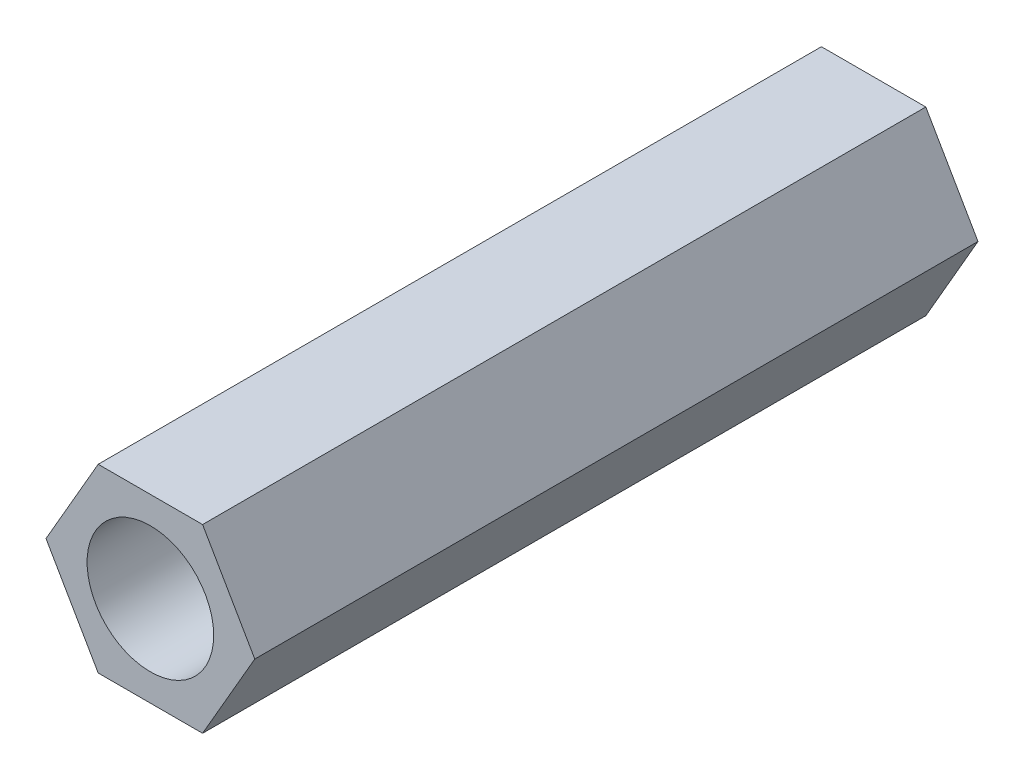
ISO-10303-21;
HEADER;
FILE_DESCRIPTION(('STEP AP214'),'2;1');
FILE_NAME('part.step','',(''),(''),'','','');
FILE_SCHEMA(('AUTOMOTIVE_DESIGN { 1 0 10303 214 1 1 1 1 }'));
ENDSEC;
DATA;
#1=APPLICATION_CONTEXT('core data for automotive mechanical design processes');
#2=APPLICATION_PROTOCOL_DEFINITION('international standard','automotive_design',2000,#1);
#3=PRODUCT_CONTEXT('',#1,'mechanical');
#4=PRODUCT('Part','Part','',(#3));
#5=PRODUCT_RELATED_PRODUCT_CATEGORY('part','',(#4));
#6=PRODUCT_DEFINITION_FORMATION('','',#4);
#7=PRODUCT_DEFINITION_CONTEXT('part definition',#1,'design');
#8=PRODUCT_DEFINITION('design','',#6,#7);
#9=PRODUCT_DEFINITION_SHAPE('','',#8);
#10=(LENGTH_UNIT() NAMED_UNIT(*) SI_UNIT(.MILLI.,.METRE.));
#11=(NAMED_UNIT(*) PLANE_ANGLE_UNIT() SI_UNIT($,.RADIAN.));
#12=(NAMED_UNIT(*) SI_UNIT($,.STERADIAN.) SOLID_ANGLE_UNIT());
#13=UNCERTAINTY_MEASURE_WITH_UNIT(LENGTH_MEASURE(1.E-05),#10,'distance_accuracy_value','');
#14=(GEOMETRIC_REPRESENTATION_CONTEXT(3) GLOBAL_UNCERTAINTY_ASSIGNED_CONTEXT((#13)) GLOBAL_UNIT_ASSIGNED_CONTEXT((#10,
#11,#12)) REPRESENTATION_CONTEXT('',''));
#15=CARTESIAN_POINT('',(0.,0.,0.));
#16=DIRECTION('',(0.,0.,1.));
#17=DIRECTION('',(1.,0.,0.));
#18=AXIS2_PLACEMENT_3D('',#15,#16,#17);
#19=CARTESIAN_POINT('',(0.,0.,0.));
#20=DIRECTION('',(0.,0.,1.));
#21=DIRECTION('',(1.,0.,0.));
#22=AXIS2_PLACEMENT_3D('',#19,#20,#21);
#23=PLANE('',#22);
#24=DIRECTION('',(0.5,0.866025403784439,0.));
#25=VECTOR('',#24,1.);
#26=CARTESIAN_POINT('',(2.88675134594813,-5.,0.));
#27=LINE('',#26,#25);
#28=CARTESIAN_POINT('',(2.88675134594813,-5.,0.));
#29=VERTEX_POINT('',#28);
#30=CARTESIAN_POINT('',(5.77350269189626,0.,0.));
#31=VERTEX_POINT('',#30);
#32=EDGE_CURVE('E119',#29,#31,#27,.T.);
#33=ORIENTED_EDGE('',*,*,#32,.F.);
#34=DIRECTION('',(1.,0.,0.));
#35=VECTOR('',#34,1.);
#36=CARTESIAN_POINT('',(-2.88675134594813,-5.,0.));
#37=LINE('',#36,#35);
#38=CARTESIAN_POINT('',(-2.88675134594813,-5.,0.));
#39=VERTEX_POINT('',#38);
#40=EDGE_CURVE('E79',#39,#29,#37,.T.);
#41=ORIENTED_EDGE('',*,*,#40,.F.);
#42=DIRECTION('',(0.5,-0.866025403784439,0.));
#43=VECTOR('',#42,1.);
#44=CARTESIAN_POINT('',(-5.77350269189626,0.,0.));
#45=LINE('',#44,#43);
#46=CARTESIAN_POINT('',(-5.77350269189626,0.,0.));
#47=VERTEX_POINT('',#46);
#48=EDGE_CURVE('E73',#47,#39,#45,.T.);
#49=ORIENTED_EDGE('',*,*,#48,.F.);
#50=DIRECTION('',(-0.5,-0.866025403784439,0.));
#51=VECTOR('',#50,1.);
#52=CARTESIAN_POINT('',(-2.88675134594813,5.,0.));
#53=LINE('',#52,#51);
#54=CARTESIAN_POINT('',(-2.88675134594813,5.,0.));
#55=VERTEX_POINT('',#54);
#56=EDGE_CURVE('E109',#55,#47,#53,.T.);
#57=ORIENTED_EDGE('',*,*,#56,.F.);
#58=DIRECTION('',(-1.,0.,0.));
#59=VECTOR('',#58,1.);
#60=CARTESIAN_POINT('',(2.88675134594813,5.,0.));
#61=LINE('',#60,#59);
#62=CARTESIAN_POINT('',(2.88675134594813,5.,0.));
#63=VERTEX_POINT('',#62);
#64=EDGE_CURVE('E125',#63,#55,#61,.T.);
#65=ORIENTED_EDGE('',*,*,#64,.F.);
#66=DIRECTION('',(-0.5,0.866025403784439,0.));
#67=VECTOR('',#66,1.);
#68=CARTESIAN_POINT('',(5.77350269189626,0.,0.));
#69=LINE('',#68,#67);
#70=EDGE_CURVE('E122',#31,#63,#69,.T.);
#71=ORIENTED_EDGE('',*,*,#70,.F.);
#72=EDGE_LOOP('',(#33,#41,#49,#57,#65,#71));
#73=FACE_BOUND('',#72,.T.);
#74=CARTESIAN_POINT('',(0.,0.,0.));
#75=DIRECTION('',(0.,0.,-1.));
#76=DIRECTION('',(-1.,0.,0.));
#77=AXIS2_PLACEMENT_3D('',#74,#75,#76);
#78=CIRCLE('',#77,4.);
#79=CARTESIAN_POINT('',(-4.,0.,0.));
#80=VERTEX_POINT('',#79);
#81=EDGE_CURVE('E183',#80,#80,#78,.T.);
#82=ORIENTED_EDGE('',*,*,#81,.F.);
#83=EDGE_LOOP('',(#82));
#84=FACE_BOUND('',#83,.T.);
#85=ADVANCED_FACE('F32',(#73,#84),#23,.F.);
#86=CARTESIAN_POINT('',(2.88675134594813,-5.,40.));
#87=DIRECTION('',(-0.866025403784439,0.5,0.));
#88=DIRECTION('',(-0.5,-0.866025403784439,0.));
#89=AXIS2_PLACEMENT_3D('',#86,#87,#88);
#90=PLANE('',#89);
#91=ORIENTED_EDGE('',*,*,#32,.T.);
#92=DIRECTION('',(0.,0.,-1.));
#93=VECTOR('',#92,1.);
#94=CARTESIAN_POINT('',(5.77350269189626,0.,40.));
#95=LINE('',#94,#93);
#96=CARTESIAN_POINT('',(5.77350269189626,0.,40.));
#97=VERTEX_POINT('',#96);
#98=EDGE_CURVE('E11',#97,#31,#95,.T.);
#99=ORIENTED_EDGE('',*,*,#98,.F.);
#100=DIRECTION('',(0.5,0.866025403784439,0.));
#101=VECTOR('',#100,1.);
#102=CARTESIAN_POINT('',(2.88675134594813,-5.,40.));
#103=LINE('',#102,#101);
#104=CARTESIAN_POINT('',(2.88675134594813,-5.,40.));
#105=VERTEX_POINT('',#104);
#106=EDGE_CURVE('E130',#105,#97,#103,.T.);
#107=ORIENTED_EDGE('',*,*,#106,.F.);
#108=DIRECTION('',(0.,0.,-1.));
#109=VECTOR('',#108,1.);
#110=CARTESIAN_POINT('',(2.88675134594813,-5.,40.));
#111=LINE('',#110,#109);
#112=EDGE_CURVE('E115',#105,#29,#111,.T.);
#113=ORIENTED_EDGE('',*,*,#112,.T.);
#114=EDGE_LOOP('',(#91,#99,#107,#113));
#115=FACE_BOUND('',#114,.T.);
#116=ADVANCED_FACE('F34',(#115),#90,.F.);
#117=CARTESIAN_POINT('',(5.77350269189626,0.,40.));
#118=DIRECTION('',(-0.866025403784439,-0.5,0.));
#119=DIRECTION('',(0.5,-0.866025403784439,0.));
#120=AXIS2_PLACEMENT_3D('',#117,#118,#119);
#121=PLANE('',#120);
#122=ORIENTED_EDGE('',*,*,#70,.T.);
#123=DIRECTION('',(0.,0.,-1.));
#124=VECTOR('',#123,1.);
#125=CARTESIAN_POINT('',(2.88675134594813,5.,40.));
#126=LINE('',#125,#124);
#127=CARTESIAN_POINT('',(2.88675134594813,5.,40.));
#128=VERTEX_POINT('',#127);
#129=EDGE_CURVE('E41',#128,#63,#126,.T.);
#130=ORIENTED_EDGE('',*,*,#129,.F.);
#131=DIRECTION('',(-0.5,0.866025403784439,0.));
#132=VECTOR('',#131,1.);
#133=CARTESIAN_POINT('',(5.77350269189626,0.,40.));
#134=LINE('',#133,#132);
#135=EDGE_CURVE('E87',#97,#128,#134,.T.);
#136=ORIENTED_EDGE('',*,*,#135,.F.);
#137=ORIENTED_EDGE('',*,*,#98,.T.);
#138=EDGE_LOOP('',(#122,#130,#136,#137));
#139=FACE_BOUND('',#138,.T.);
#140=ADVANCED_FACE('F159',(#139),#121,.F.);
#141=CARTESIAN_POINT('',(2.88675134594813,5.,40.));
#142=DIRECTION('',(0.,-1.,0.));
#143=DIRECTION('',(1.,0.,0.));
#144=AXIS2_PLACEMENT_3D('',#141,#142,#143);
#145=PLANE('',#144);
#146=ORIENTED_EDGE('',*,*,#64,.T.);
#147=DIRECTION('',(0.,0.,-1.));
#148=VECTOR('',#147,1.);
#149=CARTESIAN_POINT('',(-2.88675134594813,5.,40.));
#150=LINE('',#149,#148);
#151=CARTESIAN_POINT('',(-2.88675134594813,5.,40.));
#152=VERTEX_POINT('',#151);
#153=EDGE_CURVE('E110',#152,#55,#150,.T.);
#154=ORIENTED_EDGE('',*,*,#153,.F.);
#155=DIRECTION('',(-1.,0.,0.));
#156=VECTOR('',#155,1.);
#157=CARTESIAN_POINT('',(2.88675134594813,5.,40.));
#158=LINE('',#157,#156);
#159=EDGE_CURVE('E101',#128,#152,#158,.T.);
#160=ORIENTED_EDGE('',*,*,#159,.F.);
#161=ORIENTED_EDGE('',*,*,#129,.T.);
#162=EDGE_LOOP('',(#146,#154,#160,#161));
#163=FACE_BOUND('',#162,.T.);
#164=ADVANCED_FACE('F136',(#163),#145,.F.);
#165=CARTESIAN_POINT('',(-2.88675134594813,5.,40.));
#166=DIRECTION('',(0.866025403784439,-0.5,0.));
#167=DIRECTION('',(0.5,0.866025403784439,0.));
#168=AXIS2_PLACEMENT_3D('',#165,#166,#167);
#169=PLANE('',#168);
#170=ORIENTED_EDGE('',*,*,#56,.T.);
#171=DIRECTION('',(0.,0.,-1.));
#172=VECTOR('',#171,1.);
#173=CARTESIAN_POINT('',(-5.77350269189626,0.,40.));
#174=LINE('',#173,#172);
#175=CARTESIAN_POINT('',(-5.77350269189626,0.,40.));
#176=VERTEX_POINT('',#175);
#177=EDGE_CURVE('E106',#176,#47,#174,.T.);
#178=ORIENTED_EDGE('',*,*,#177,.F.);
#179=DIRECTION('',(-0.5,-0.866025403784439,0.));
#180=VECTOR('',#179,1.);
#181=CARTESIAN_POINT('',(-2.88675134594813,5.,40.));
#182=LINE('',#181,#180);
#183=EDGE_CURVE('E95',#152,#176,#182,.T.);
#184=ORIENTED_EDGE('',*,*,#183,.F.);
#185=ORIENTED_EDGE('',*,*,#153,.T.);
#186=EDGE_LOOP('',(#170,#178,#184,#185));
#187=FACE_BOUND('',#186,.T.);
#188=ADVANCED_FACE('F107',(#187),#169,.F.);
#189=CARTESIAN_POINT('',(-5.77350269189626,0.,40.));
#190=DIRECTION('',(0.866025403784439,0.5,0.));
#191=DIRECTION('',(-0.5,0.866025403784439,0.));
#192=AXIS2_PLACEMENT_3D('',#189,#190,#191);
#193=PLANE('',#192);
#194=ORIENTED_EDGE('',*,*,#48,.T.);
#195=DIRECTION('',(0.,0.,-1.));
#196=VECTOR('',#195,1.);
#197=CARTESIAN_POINT('',(-2.88675134594813,-5.,40.));
#198=LINE('',#197,#196);
#199=CARTESIAN_POINT('',(-2.88675134594813,-5.,40.));
#200=VERTEX_POINT('',#199);
#201=EDGE_CURVE('E111',#200,#39,#198,.T.);
#202=ORIENTED_EDGE('',*,*,#201,.F.);
#203=DIRECTION('',(0.5,-0.866025403784439,0.));
#204=VECTOR('',#203,1.);
#205=CARTESIAN_POINT('',(-5.77350269189626,0.,40.));
#206=LINE('',#205,#204);
#207=EDGE_CURVE('E99',#176,#200,#206,.T.);
#208=ORIENTED_EDGE('',*,*,#207,.F.);
#209=ORIENTED_EDGE('',*,*,#177,.T.);
#210=EDGE_LOOP('',(#194,#202,#208,#209));
#211=FACE_BOUND('',#210,.T.);
#212=ADVANCED_FACE('F113',(#211),#193,.F.);
#213=CARTESIAN_POINT('',(-2.88675134594813,-5.,40.));
#214=DIRECTION('',(0.,1.,0.));
#215=DIRECTION('',(-1.,0.,0.));
#216=AXIS2_PLACEMENT_3D('',#213,#214,#215);
#217=PLANE('',#216);
#218=ORIENTED_EDGE('',*,*,#40,.T.);
#219=ORIENTED_EDGE('',*,*,#112,.F.);
#220=DIRECTION('',(1.,0.,0.));
#221=VECTOR('',#220,1.);
#222=CARTESIAN_POINT('',(-2.88675134594813,-5.,40.));
#223=LINE('',#222,#221);
#224=EDGE_CURVE('E49',#200,#105,#223,.T.);
#225=ORIENTED_EDGE('',*,*,#224,.F.);
#226=ORIENTED_EDGE('',*,*,#201,.T.);
#227=EDGE_LOOP('',(#218,#219,#225,#226));
#228=FACE_BOUND('',#227,.T.);
#229=ADVANCED_FACE('F143',(#228),#217,.F.);
#230=CARTESIAN_POINT('',(0.,0.,40.));
#231=DIRECTION('',(0.,0.,1.));
#232=DIRECTION('',(1.,0.,0.));
#233=AXIS2_PLACEMENT_3D('',#230,#231,#232);
#234=PLANE('',#233);
#235=CARTESIAN_POINT('',(0.,0.,40.));
#236=DIRECTION('',(0.,0.,1.));
#237=DIRECTION('',(1.,0.,0.));
#238=AXIS2_PLACEMENT_3D('',#235,#236,#237);
#239=CIRCLE('',#238,3.5);
#240=CARTESIAN_POINT('',(3.5,0.,40.));
#241=VERTEX_POINT('',#240);
#242=EDGE_CURVE('E185',#241,#241,#239,.T.);
#243=ORIENTED_EDGE('',*,*,#242,.F.);
#244=EDGE_LOOP('',(#243));
#245=FACE_BOUND('',#244,.T.);
#246=ORIENTED_EDGE('',*,*,#106,.T.);
#247=ORIENTED_EDGE('',*,*,#135,.T.);
#248=ORIENTED_EDGE('',*,*,#159,.T.);
#249=ORIENTED_EDGE('',*,*,#183,.T.);
#250=ORIENTED_EDGE('',*,*,#207,.T.);
#251=ORIENTED_EDGE('',*,*,#224,.T.);
#252=EDGE_LOOP('',(#246,#247,#248,#249,#250,#251));
#253=FACE_BOUND('',#252,.T.);
#254=ADVANCED_FACE('F97',(#245,#253),#234,.T.);
#255=CARTESIAN_POINT('',(0.,0.,25.));
#256=DIRECTION('',(0.,0.,1.));
#257=DIRECTION('',(1.,0.,0.));
#258=AXIS2_PLACEMENT_3D('',#255,#256,#257);
#259=CYLINDRICAL_SURFACE('',#258,3.5);
#260=CARTESIAN_POINT('',(0.,0.,25.));
#261=DIRECTION('',(0.,0.,1.));
#262=DIRECTION('',(1.,0.,0.));
#263=AXIS2_PLACEMENT_3D('',#260,#261,#262);
#264=CIRCLE('',#263,3.5);
#265=CARTESIAN_POINT('',(3.5,0.,25.));
#266=VERTEX_POINT('',#265);
#267=EDGE_CURVE('E123',#266,#266,#264,.T.);
#268=ORIENTED_EDGE('',*,*,#267,.F.);
#269=EDGE_LOOP('',(#268));
#270=FACE_BOUND('',#269,.T.);
#271=ORIENTED_EDGE('',*,*,#242,.T.);
#272=EDGE_LOOP('',(#271));
#273=FACE_BOUND('',#272,.T.);
#274=ADVANCED_FACE('F150',(#270,#273),#259,.F.);
#275=CARTESIAN_POINT('',(0.,0.,25.));
#276=DIRECTION('',(0.,0.,1.));
#277=DIRECTION('',(1.,0.,0.));
#278=AXIS2_PLACEMENT_3D('',#275,#276,#277);
#279=PLANE('',#278);
#280=ORIENTED_EDGE('',*,*,#267,.T.);
#281=EDGE_LOOP('',(#280));
#282=FACE_BOUND('',#281,.T.);
#283=ADVANCED_FACE('F163',(#282),#279,.T.);
#284=CARTESIAN_POINT('',(0.,0.,15.));
#285=DIRECTION('',(0.,0.,-1.));
#286=DIRECTION('',(-1.,0.,0.));
#287=AXIS2_PLACEMENT_3D('',#284,#285,#286);
#288=CONICAL_SURFACE('',#287,4.,1.02974425867665);
#289=CARTESIAN_POINT('',(0.,0.,17.4034424761102));
#290=VERTEX_POINT('',#289);
#291=VERTEX_LOOP('',#290);
#292=FACE_BOUND('',#291,.T.);
#293=CARTESIAN_POINT('',(0.,0.,15.));
#294=DIRECTION('',(0.,0.,-1.));
#295=DIRECTION('',(-1.,0.,0.));
#296=AXIS2_PLACEMENT_3D('',#293,#294,#295);
#297=CIRCLE('',#296,4.);
#298=CARTESIAN_POINT('',(-4.,0.,15.));
#299=VERTEX_POINT('',#298);
#300=EDGE_CURVE('E180',#299,#299,#297,.T.);
#301=ORIENTED_EDGE('',*,*,#300,.T.);
#302=EDGE_LOOP('',(#301));
#303=FACE_BOUND('',#302,.T.);
#304=ADVANCED_FACE('F167',(#292,#303),#288,.F.);
#305=CARTESIAN_POINT('',(0.,0.,0.));
#306=DIRECTION('',(0.,0.,-1.));
#307=DIRECTION('',(-1.,0.,0.));
#308=AXIS2_PLACEMENT_3D('',#305,#306,#307);
#309=CYLINDRICAL_SURFACE('',#308,4.);
#310=ORIENTED_EDGE('',*,*,#300,.F.);
#311=EDGE_LOOP('',(#310));
#312=FACE_BOUND('',#311,.T.);
#313=ORIENTED_EDGE('',*,*,#81,.T.);
#314=EDGE_LOOP('',(#313));
#315=FACE_BOUND('',#314,.T.);
#316=ADVANCED_FACE('F171',(#312,#315),#309,.F.);
#317=CLOSED_SHELL('',(#85,#116,#140,#164,#188,#212,#229,#254,#274,#283,#304,#316));
#318=MANIFOLD_SOLID_BREP('B2',#317);
#319=ADVANCED_BREP_SHAPE_REPRESENTATION('',(#18,#318),#14);
#320=SHAPE_DEFINITION_REPRESENTATION(#9,#319);
ENDSEC;
END-ISO-10303-21;
